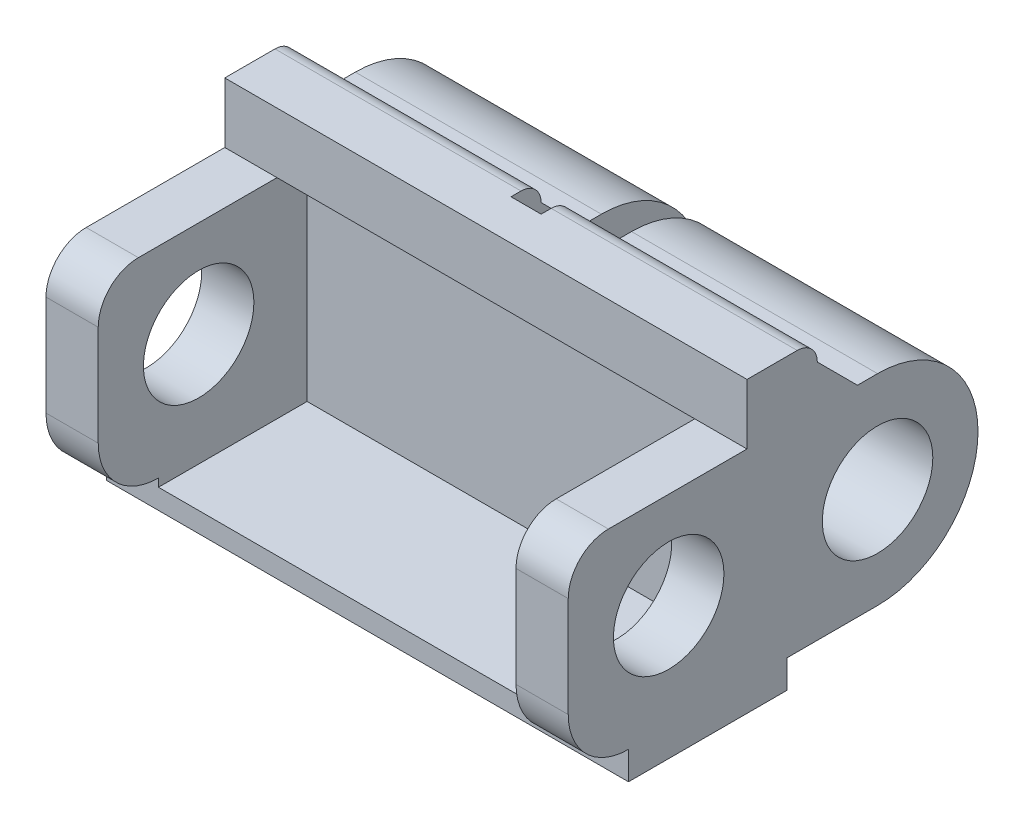
ISO-10303-21;
HEADER;
FILE_DESCRIPTION(('STEP AP214'),'2;1');
FILE_NAME('part.step','',(''),(''),'','','');
FILE_SCHEMA(('AUTOMOTIVE_DESIGN { 1 0 10303 214 1 1 1 1 }'));
ENDSEC;
DATA;
#1=APPLICATION_CONTEXT('core data for automotive mechanical design processes');
#2=APPLICATION_PROTOCOL_DEFINITION('international standard','automotive_design',2000,#1);
#3=PRODUCT_CONTEXT('',#1,'mechanical');
#4=PRODUCT('Part','Part','',(#3));
#5=PRODUCT_RELATED_PRODUCT_CATEGORY('part','',(#4));
#6=PRODUCT_DEFINITION_FORMATION('','',#4);
#7=PRODUCT_DEFINITION_CONTEXT('part definition',#1,'design');
#8=PRODUCT_DEFINITION('design','',#6,#7);
#9=PRODUCT_DEFINITION_SHAPE('','',#8);
#10=(LENGTH_UNIT() NAMED_UNIT(*) SI_UNIT(.MILLI.,.METRE.));
#11=(NAMED_UNIT(*) PLANE_ANGLE_UNIT() SI_UNIT($,.RADIAN.));
#12=(NAMED_UNIT(*) SI_UNIT($,.STERADIAN.) SOLID_ANGLE_UNIT());
#13=UNCERTAINTY_MEASURE_WITH_UNIT(LENGTH_MEASURE(1.E-05),#10,'distance_accuracy_value','');
#14=(GEOMETRIC_REPRESENTATION_CONTEXT(3) GLOBAL_UNCERTAINTY_ASSIGNED_CONTEXT((#13)) GLOBAL_UNIT_ASSIGNED_CONTEXT((#10,
#11,#12)) REPRESENTATION_CONTEXT('',''));
#15=CARTESIAN_POINT('',(0.,0.,0.));
#16=DIRECTION('',(0.,0.,1.));
#17=DIRECTION('',(1.,0.,0.));
#18=AXIS2_PLACEMENT_3D('',#15,#16,#17);
#19=CARTESIAN_POINT('',(0.,44.45,0.));
#20=DIRECTION('',(0.,1.,0.));
#21=DIRECTION('',(0.,0.,1.));
#22=AXIS2_PLACEMENT_3D('',#19,#20,#21);
#23=PLANE('',#22);
#24=DIRECTION('',(0.,0.,1.));
#25=VECTOR('',#24,1.);
#26=CARTESIAN_POINT('',(-13.,44.45,0.));
#27=LINE('',#26,#25);
#28=CARTESIAN_POINT('',(-13.,44.45,35.6));
#29=VERTEX_POINT('',#28);
#30=CARTESIAN_POINT('',(-13.,44.45,38.1));
#31=VERTEX_POINT('',#30);
#32=EDGE_CURVE('E245',#29,#31,#27,.T.);
#33=ORIENTED_EDGE('',*,*,#32,.T.);
#34=DIRECTION('',(-1.,0.,0.));
#35=VECTOR('',#34,1.);
#36=CARTESIAN_POINT('',(13.,44.45,38.1));
#37=LINE('',#36,#35);
#38=CARTESIAN_POINT('',(13.,44.45,38.1));
#39=VERTEX_POINT('',#38);
#40=EDGE_CURVE('E232',#39,#31,#37,.T.);
#41=ORIENTED_EDGE('',*,*,#40,.F.);
#42=DIRECTION('',(0.,0.,-1.));
#43=VECTOR('',#42,1.);
#44=CARTESIAN_POINT('',(13.,44.45,0.));
#45=LINE('',#44,#43);
#46=CARTESIAN_POINT('',(13.,44.45,35.6));
#47=VERTEX_POINT('',#46);
#48=EDGE_CURVE('E242',#39,#47,#45,.T.);
#49=ORIENTED_EDGE('',*,*,#48,.T.);
#50=DIRECTION('',(1.,0.,0.));
#51=VECTOR('',#50,1.);
#52=CARTESIAN_POINT('',(0.,44.45,35.6));
#53=LINE('',#52,#51);
#54=CARTESIAN_POINT('',(0.749999999999987,44.45,35.6));
#55=VERTEX_POINT('',#54);
#56=EDGE_CURVE('E422',#47,#55,#53,.F.);
#57=ORIENTED_EDGE('',*,*,#56,.T.);
#58=DIRECTION('',(0.,0.,1.));
#59=VECTOR('',#58,1.);
#60=CARTESIAN_POINT('',(0.749999999999987,44.45,0.));
#61=LINE('',#60,#59);
#62=CARTESIAN_POINT('',(0.749999999999987,44.45,36.1));
#63=VERTEX_POINT('',#62);
#64=EDGE_CURVE('E253',#55,#63,#61,.T.);
#65=ORIENTED_EDGE('',*,*,#64,.T.);
#66=DIRECTION('',(-1.,0.,0.));
#67=VECTOR('',#66,1.);
#68=CARTESIAN_POINT('',(0.,44.45,36.1));
#69=LINE('',#68,#67);
#70=CARTESIAN_POINT('',(-0.750000000000015,44.45,36.1));
#71=VERTEX_POINT('',#70);
#72=EDGE_CURVE('E255',#63,#71,#69,.T.);
#73=ORIENTED_EDGE('',*,*,#72,.T.);
#74=DIRECTION('',(0.,0.,-1.));
#75=VECTOR('',#74,1.);
#76=CARTESIAN_POINT('',(-0.750000000000015,44.45,0.));
#77=LINE('',#76,#75);
#78=CARTESIAN_POINT('',(-0.750000000000015,44.45,35.6));
#79=VERTEX_POINT('',#78);
#80=EDGE_CURVE('E263',#71,#79,#77,.T.);
#81=ORIENTED_EDGE('',*,*,#80,.T.);
#82=DIRECTION('',(1.,0.,0.));
#83=VECTOR('',#82,1.);
#84=CARTESIAN_POINT('',(0.,44.45,35.6));
#85=LINE('',#84,#83);
#86=EDGE_CURVE('E424',#79,#29,#85,.F.);
#87=ORIENTED_EDGE('',*,*,#86,.T.);
#88=EDGE_LOOP('',(#33,#41,#49,#57,#65,#73,#81,#87));
#89=FACE_BOUND('',#88,.T.);
#90=ADVANCED_FACE('F38',(#89),#23,.T.);
#91=CARTESIAN_POINT('',(-13.,41.45,37.6));
#92=DIRECTION('',(0.,1.,0.));
#93=DIRECTION('',(0.,0.,1.));
#94=AXIS2_PLACEMENT_3D('',#91,#92,#93);
#95=PLANE('',#94);
#96=DIRECTION('',(1.,0.,0.));
#97=VECTOR('',#96,1.);
#98=CARTESIAN_POINT('',(-13.,41.45,38.1));
#99=LINE('',#98,#97);
#100=CARTESIAN_POINT('',(-10.4,41.45,38.1));
#101=VERTEX_POINT('',#100);
#102=CARTESIAN_POINT('',(10.4,41.45,38.1));
#103=VERTEX_POINT('',#102);
#104=EDGE_CURVE('E499',#101,#103,#99,.T.);
#105=ORIENTED_EDGE('',*,*,#104,.F.);
#106=DIRECTION('',(0.,0.,1.));
#107=VECTOR('',#106,1.);
#108=CARTESIAN_POINT('',(-10.4,41.45,36.6));
#109=LINE('',#108,#107);
#110=CARTESIAN_POINT('',(-10.4,41.45,36.6));
#111=VERTEX_POINT('',#110);
#112=EDGE_CURVE('E365',#111,#101,#109,.T.);
#113=ORIENTED_EDGE('',*,*,#112,.F.);
#114=DIRECTION('',(1.,0.,0.));
#115=VECTOR('',#114,1.);
#116=CARTESIAN_POINT('',(-13.,41.45,36.6));
#117=LINE('',#116,#115);
#118=CARTESIAN_POINT('',(10.4,41.45,36.6));
#119=VERTEX_POINT('',#118);
#120=EDGE_CURVE('E482',#111,#119,#117,.T.);
#121=ORIENTED_EDGE('',*,*,#120,.T.);
#122=DIRECTION('',(0.,0.,-1.));
#123=VECTOR('',#122,1.);
#124=CARTESIAN_POINT('',(10.4,41.45,44.));
#125=LINE('',#124,#123);
#126=EDGE_CURVE('E484',#103,#119,#125,.T.);
#127=ORIENTED_EDGE('',*,*,#126,.F.);
#128=EDGE_LOOP('',(#105,#113,#121,#127));
#129=FACE_BOUND('',#128,.T.);
#130=ADVANCED_FACE('F498',(#129),#95,.F.);
#131=CARTESIAN_POINT('',(-27.142135623731,0.,36.6));
#132=DIRECTION('',(0.,0.,-1.));
#133=DIRECTION('',(-1.,0.,0.));
#134=AXIS2_PLACEMENT_3D('',#131,#132,#133);
#135=PLANE('',#134);
#136=ORIENTED_EDGE('',*,*,#120,.F.);
#137=DIRECTION('',(0.,1.,0.));
#138=VECTOR('',#137,1.);
#139=CARTESIAN_POINT('',(-10.4,31.45,36.6));
#140=LINE('',#139,#138);
#141=CARTESIAN_POINT('',(-10.4,31.05,36.6));
#142=VERTEX_POINT('',#141);
#143=EDGE_CURVE('E352',#142,#111,#140,.T.);
#144=ORIENTED_EDGE('',*,*,#143,.F.);
#145=DIRECTION('',(-1.,0.,0.));
#146=VECTOR('',#145,1.);
#147=CARTESIAN_POINT('',(-27.142135623731,31.05,36.6));
#148=LINE('',#147,#146);
#149=CARTESIAN_POINT('',(10.4,31.05,36.6));
#150=VERTEX_POINT('',#149);
#151=EDGE_CURVE('E276',#150,#142,#148,.T.);
#152=ORIENTED_EDGE('',*,*,#151,.F.);
#153=DIRECTION('',(0.,-1.,0.));
#154=VECTOR('',#153,1.);
#155=CARTESIAN_POINT('',(10.4,41.45,36.6));
#156=LINE('',#155,#154);
#157=EDGE_CURVE('E315',#119,#150,#156,.T.);
#158=ORIENTED_EDGE('',*,*,#157,.F.);
#159=EDGE_LOOP('',(#136,#144,#152,#158));
#160=FACE_BOUND('',#159,.T.);
#161=ADVANCED_FACE('F496',(#160),#135,.F.);
#162=CARTESIAN_POINT('',(-13.,41.45,47.));
#163=DIRECTION('',(0.,-1.,0.));
#164=DIRECTION('',(0.,0.,-1.));
#165=AXIS2_PLACEMENT_3D('',#162,#163,#164);
#166=PLANE('',#165);
#167=DIRECTION('',(0.,0.,-1.));
#168=VECTOR('',#167,1.);
#169=CARTESIAN_POINT('',(-13.,41.45,47.));
#170=LINE('',#169,#168);
#171=CARTESIAN_POINT('',(-13.,41.45,32.6));
#172=VERTEX_POINT('',#171);
#173=CARTESIAN_POINT('',(-13.,41.45,31.6));
#174=VERTEX_POINT('',#173);
#175=EDGE_CURVE('E386',#172,#174,#170,.T.);
#176=ORIENTED_EDGE('',*,*,#175,.F.);
#177=DIRECTION('',(1.,0.,0.));
#178=VECTOR('',#177,1.);
#179=CARTESIAN_POINT('',(-13.,41.45,32.6));
#180=LINE('',#179,#178);
#181=CARTESIAN_POINT('',(-0.750000000000015,41.45,32.6));
#182=VERTEX_POINT('',#181);
#183=EDGE_CURVE('E395',#172,#182,#180,.T.);
#184=ORIENTED_EDGE('',*,*,#183,.T.);
#185=DIRECTION('',(0.,0.,1.));
#186=VECTOR('',#185,1.);
#187=CARTESIAN_POINT('',(-0.750000000000015,41.45,47.));
#188=LINE('',#187,#186);
#189=CARTESIAN_POINT('',(-0.750000000000015,41.45,31.6));
#190=VERTEX_POINT('',#189);
#191=EDGE_CURVE('E309',#190,#182,#188,.T.);
#192=ORIENTED_EDGE('',*,*,#191,.F.);
#193=DIRECTION('',(1.,0.,0.));
#194=VECTOR('',#193,1.);
#195=CARTESIAN_POINT('',(-27.142135623731,41.45,31.6));
#196=LINE('',#195,#194);
#197=EDGE_CURVE('E359',#174,#190,#196,.T.);
#198=ORIENTED_EDGE('',*,*,#197,.F.);
#199=EDGE_LOOP('',(#176,#184,#192,#198));
#200=FACE_BOUND('',#199,.T.);
#201=ADVANCED_FACE('F579',(#200),#166,.F.);
#202=DIRECTION('',(0.,0.,-1.));
#203=VECTOR('',#202,1.);
#204=CARTESIAN_POINT('',(13.,41.45,0.));
#205=LINE('',#204,#203);
#206=CARTESIAN_POINT('',(13.,41.45,45.));
#207=VERTEX_POINT('',#206);
#208=CARTESIAN_POINT('',(13.,41.45,38.1));
#209=VERTEX_POINT('',#208);
#210=EDGE_CURVE('E341',#207,#209,#205,.T.);
#211=ORIENTED_EDGE('',*,*,#210,.T.);
#212=EDGE_CURVE('E235',#103,#209,#99,.T.);
#213=ORIENTED_EDGE('',*,*,#212,.F.);
#214=CARTESIAN_POINT('',(10.4,41.45,45.));
#215=VERTEX_POINT('',#214);
#216=EDGE_CURVE('E257',#215,#103,#125,.T.);
#217=ORIENTED_EDGE('',*,*,#216,.F.);
#218=DIRECTION('',(-1.,0.,0.));
#219=VECTOR('',#218,1.);
#220=CARTESIAN_POINT('',(-13.,41.45,45.));
#221=LINE('',#220,#219);
#222=EDGE_CURVE('E437',#215,#207,#221,.F.);
#223=ORIENTED_EDGE('',*,*,#222,.T.);
#224=EDGE_LOOP('',(#211,#213,#217,#223));
#225=FACE_BOUND('',#224,.T.);
#226=ADVANCED_FACE('F521',(#225),#166,.F.);
#227=CARTESIAN_POINT('',(-10.4,41.45,45.));
#228=VERTEX_POINT('',#227);
#229=EDGE_CURVE('E364',#101,#228,#109,.T.);
#230=ORIENTED_EDGE('',*,*,#229,.F.);
#231=CARTESIAN_POINT('',(-13.,41.45,38.1));
#232=VERTEX_POINT('',#231);
#233=EDGE_CURVE('E506',#232,#101,#99,.T.);
#234=ORIENTED_EDGE('',*,*,#233,.F.);
#235=CARTESIAN_POINT('',(-13.,41.45,45.));
#236=VERTEX_POINT('',#235);
#237=EDGE_CURVE('E387',#236,#232,#170,.T.);
#238=ORIENTED_EDGE('',*,*,#237,.F.);
#239=DIRECTION('',(1.,0.,0.));
#240=VECTOR('',#239,1.);
#241=CARTESIAN_POINT('',(-13.,41.45,45.));
#242=LINE('',#241,#240);
#243=EDGE_CURVE('E441',#236,#228,#242,.T.);
#244=ORIENTED_EDGE('',*,*,#243,.T.);
#245=EDGE_LOOP('',(#230,#234,#238,#244));
#246=FACE_BOUND('',#245,.T.);
#247=ADVANCED_FACE('F447',(#246),#166,.F.);
#248=CARTESIAN_POINT('',(-10.4,34.45,44.));
#249=DIRECTION('',(1.,0.,0.));
#250=DIRECTION('',(0.,0.,-1.));
#251=AXIS2_PLACEMENT_3D('',#248,#249,#250);
#252=PLANE('',#251);
#253=CARTESIAN_POINT('',(-10.4,36.65,42.));
#254=DIRECTION('',(1.,0.,0.));
#255=DIRECTION('',(0.,0.,-1.));
#256=AXIS2_PLACEMENT_3D('',#253,#254,#255);
#257=CIRCLE('',#256,2.75);
#258=CARTESIAN_POINT('',(-10.4,36.65,39.25));
#259=VERTEX_POINT('',#258);
#260=EDGE_CURVE('E373',#259,#259,#257,.T.);
#261=ORIENTED_EDGE('',*,*,#260,.F.);
#262=EDGE_LOOP('',(#261));
#263=FACE_BOUND('',#262,.T.);
#264=ORIENTED_EDGE('',*,*,#112,.T.);
#265=ORIENTED_EDGE('',*,*,#229,.T.);
#266=CARTESIAN_POINT('',(-10.4,39.45,45.));
#267=DIRECTION('',(1.,0.,0.));
#268=DIRECTION('',(0.,0.,-1.));
#269=AXIS2_PLACEMENT_3D('',#266,#267,#268);
#270=CIRCLE('',#269,2.);
#271=CARTESIAN_POINT('',(-10.4,39.45,47.));
#272=VERTEX_POINT('',#271);
#273=EDGE_CURVE('E60',#228,#272,#270,.T.);
#274=ORIENTED_EDGE('',*,*,#273,.T.);
#275=DIRECTION('',(0.,-1.,0.));
#276=VECTOR('',#275,1.);
#277=CARTESIAN_POINT('',(-10.4,41.45,47.));
#278=LINE('',#277,#276);
#279=CARTESIAN_POINT('',(-10.4,34.45,47.));
#280=VERTEX_POINT('',#279);
#281=EDGE_CURVE('E368',#272,#280,#278,.T.);
#282=ORIENTED_EDGE('',*,*,#281,.T.);
#283=CARTESIAN_POINT('',(-10.4,34.45,44.));
#284=DIRECTION('',(1.,0.,0.));
#285=DIRECTION('',(0.,0.,-1.));
#286=AXIS2_PLACEMENT_3D('',#283,#284,#285);
#287=CIRCLE('',#286,3.);
#288=CARTESIAN_POINT('',(-10.4,31.45,44.));
#289=VERTEX_POINT('',#288);
#290=EDGE_CURVE('E370',#280,#289,#287,.T.);
#291=ORIENTED_EDGE('',*,*,#290,.T.);
#292=DIRECTION('',(0.,1.,0.));
#293=VECTOR('',#292,1.);
#294=CARTESIAN_POINT('',(-10.4,31.05,44.));
#295=LINE('',#294,#293);
#296=CARTESIAN_POINT('',(-10.4,31.05,44.));
#297=VERTEX_POINT('',#296);
#298=EDGE_CURVE('E464',#297,#289,#295,.T.);
#299=ORIENTED_EDGE('',*,*,#298,.F.);
#300=DIRECTION('',(0.,0.,-1.));
#301=VECTOR('',#300,1.);
#302=CARTESIAN_POINT('',(-10.4,31.05,44.));
#303=LINE('',#302,#301);
#304=EDGE_CURVE('E279',#297,#142,#303,.T.);
#305=ORIENTED_EDGE('',*,*,#304,.T.);
#306=ORIENTED_EDGE('',*,*,#143,.T.);
#307=EDGE_LOOP('',(#264,#265,#274,#282,#291,#299,#305,#306));
#308=FACE_BOUND('',#307,.T.);
#309=ADVANCED_FACE('F463',(#263,#308),#252,.T.);
#310=CARTESIAN_POINT('',(10.4,34.45,44.));
#311=DIRECTION('',(-1.,0.,0.));
#312=DIRECTION('',(0.,0.,1.));
#313=AXIS2_PLACEMENT_3D('',#310,#311,#312);
#314=PLANE('',#313);
#315=DIRECTION('',(0.,-1.,0.));
#316=VECTOR('',#315,1.);
#317=CARTESIAN_POINT('',(10.4,31.45,44.));
#318=LINE('',#317,#316);
#319=CARTESIAN_POINT('',(10.4,31.45,44.));
#320=VERTEX_POINT('',#319);
#321=CARTESIAN_POINT('',(10.4,31.05,44.));
#322=VERTEX_POINT('',#321);
#323=EDGE_CURVE('E474',#320,#322,#318,.T.);
#324=ORIENTED_EDGE('',*,*,#323,.F.);
#325=CARTESIAN_POINT('',(10.4,34.45,44.));
#326=DIRECTION('',(-1.,0.,0.));
#327=DIRECTION('',(0.,0.,1.));
#328=AXIS2_PLACEMENT_3D('',#325,#326,#327);
#329=CIRCLE('',#328,3.);
#330=CARTESIAN_POINT('',(10.4,34.45,47.));
#331=VERTEX_POINT('',#330);
#332=EDGE_CURVE('E318',#320,#331,#329,.T.);
#333=ORIENTED_EDGE('',*,*,#332,.T.);
#334=DIRECTION('',(0.,1.,0.));
#335=VECTOR('',#334,1.);
#336=CARTESIAN_POINT('',(10.4,34.45,47.));
#337=LINE('',#336,#335);
#338=CARTESIAN_POINT('',(10.4,39.45,47.));
#339=VERTEX_POINT('',#338);
#340=EDGE_CURVE('E312',#331,#339,#337,.T.);
#341=ORIENTED_EDGE('',*,*,#340,.T.);
#342=CARTESIAN_POINT('',(10.4,39.45,45.));
#343=DIRECTION('',(-1.,0.,0.));
#344=DIRECTION('',(0.,0.,1.));
#345=AXIS2_PLACEMENT_3D('',#342,#343,#344);
#346=CIRCLE('',#345,2.);
#347=EDGE_CURVE('E434',#339,#215,#346,.T.);
#348=ORIENTED_EDGE('',*,*,#347,.T.);
#349=ORIENTED_EDGE('',*,*,#216,.T.);
#350=ORIENTED_EDGE('',*,*,#126,.T.);
#351=ORIENTED_EDGE('',*,*,#157,.T.);
#352=DIRECTION('',(0.,0.,1.));
#353=VECTOR('',#352,1.);
#354=CARTESIAN_POINT('',(10.4,31.05,44.));
#355=LINE('',#354,#353);
#356=EDGE_CURVE('E274',#150,#322,#355,.T.);
#357=ORIENTED_EDGE('',*,*,#356,.T.);
#358=EDGE_LOOP('',(#324,#333,#341,#348,#349,#350,#351,#357));
#359=FACE_BOUND('',#358,.T.);
#360=CARTESIAN_POINT('',(10.4,36.65,42.));
#361=DIRECTION('',(-1.,0.,0.));
#362=DIRECTION('',(0.,0.,1.));
#363=AXIS2_PLACEMENT_3D('',#360,#361,#362);
#364=CIRCLE('',#363,2.75);
#365=CARTESIAN_POINT('',(10.4,36.65,44.75));
#366=VERTEX_POINT('',#365);
#367=EDGE_CURVE('E320',#366,#366,#364,.F.);
#368=ORIENTED_EDGE('',*,*,#367,.T.);
#369=EDGE_LOOP('',(#368));
#370=FACE_BOUND('',#369,.T.);
#371=ADVANCED_FACE('F490',(#359,#370),#314,.T.);
#372=CARTESIAN_POINT('',(-13.,31.45,40.));
#373=DIRECTION('',(0.,1.,0.));
#374=DIRECTION('',(0.,0.,1.));
#375=AXIS2_PLACEMENT_3D('',#372,#373,#374);
#376=PLANE('',#375);
#377=DIRECTION('',(1.,0.,0.));
#378=VECTOR('',#377,1.);
#379=CARTESIAN_POINT('',(13.,31.45,36.1));
#380=LINE('',#379,#378);
#381=CARTESIAN_POINT('',(-13.,31.45,36.1));
#382=VERTEX_POINT('',#381);
#383=CARTESIAN_POINT('',(-0.750000000000015,31.45,36.1));
#384=VERTEX_POINT('',#383);
#385=EDGE_CURVE('E282',#382,#384,#380,.T.);
#386=ORIENTED_EDGE('',*,*,#385,.F.);
#387=DIRECTION('',(0.,0.,1.));
#388=VECTOR('',#387,1.);
#389=CARTESIAN_POINT('',(-13.,31.45,40.));
#390=LINE('',#389,#388);
#391=CARTESIAN_POINT('',(-13.,31.45,31.6));
#392=VERTEX_POINT('',#391);
#393=EDGE_CURVE('E379',#392,#382,#390,.T.);
#394=ORIENTED_EDGE('',*,*,#393,.F.);
#395=DIRECTION('',(1.,0.,0.));
#396=VECTOR('',#395,1.);
#397=CARTESIAN_POINT('',(-27.142135623731,31.45,31.6));
#398=LINE('',#397,#396);
#399=CARTESIAN_POINT('',(-0.750000000000015,31.45,31.6));
#400=VERTEX_POINT('',#399);
#401=EDGE_CURVE('E349',#392,#400,#398,.T.);
#402=ORIENTED_EDGE('',*,*,#401,.T.);
#403=DIRECTION('',(0.,0.,-1.));
#404=VECTOR('',#403,1.);
#405=CARTESIAN_POINT('',(-0.750000000000015,31.45,36.1));
#406=LINE('',#405,#404);
#407=EDGE_CURVE('E297',#384,#400,#406,.T.);
#408=ORIENTED_EDGE('',*,*,#407,.F.);
#409=EDGE_LOOP('',(#386,#394,#402,#408));
#410=FACE_BOUND('',#409,.T.);
#411=ADVANCED_FACE('F586',(#410),#376,.F.);
#412=CARTESIAN_POINT('',(0.749999999999987,31.45,36.1));
#413=VERTEX_POINT('',#412);
#414=CARTESIAN_POINT('',(13.,31.45,36.1));
#415=VERTEX_POINT('',#414);
#416=EDGE_CURVE('E281',#413,#415,#380,.T.);
#417=ORIENTED_EDGE('',*,*,#416,.F.);
#418=DIRECTION('',(0.,0.,-1.));
#419=VECTOR('',#418,1.);
#420=CARTESIAN_POINT('',(0.749999999999987,31.45,36.1));
#421=LINE('',#420,#419);
#422=CARTESIAN_POINT('',(0.749999999999987,31.45,31.6));
#423=VERTEX_POINT('',#422);
#424=EDGE_CURVE('E294',#413,#423,#421,.T.);
#425=ORIENTED_EDGE('',*,*,#424,.T.);
#426=CARTESIAN_POINT('',(13.,31.45,31.6));
#427=VERTEX_POINT('',#426);
#428=EDGE_CURVE('E358',#423,#427,#398,.T.);
#429=ORIENTED_EDGE('',*,*,#428,.T.);
#430=DIRECTION('',(0.,0.,-1.));
#431=VECTOR('',#430,1.);
#432=CARTESIAN_POINT('',(13.,31.45,0.));
#433=LINE('',#432,#431);
#434=EDGE_CURVE('E337',#415,#427,#433,.T.);
#435=ORIENTED_EDGE('',*,*,#434,.F.);
#436=EDGE_LOOP('',(#417,#425,#429,#435));
#437=FACE_BOUND('',#436,.T.);
#438=ADVANCED_FACE('F537',(#437),#376,.F.);
#439=DIRECTION('',(0.,0.,-1.));
#440=VECTOR('',#439,1.);
#441=CARTESIAN_POINT('',(0.749999999999987,41.45,47.));
#442=LINE('',#441,#440);
#443=CARTESIAN_POINT('',(0.749999999999987,41.45,32.6));
#444=VERTEX_POINT('',#443);
#445=CARTESIAN_POINT('',(0.749999999999987,41.45,31.6));
#446=VERTEX_POINT('',#445);
#447=EDGE_CURVE('E303',#444,#446,#442,.T.);
#448=ORIENTED_EDGE('',*,*,#447,.F.);
#449=DIRECTION('',(1.,0.,0.));
#450=VECTOR('',#449,1.);
#451=CARTESIAN_POINT('',(-13.,41.45,32.6));
#452=LINE('',#451,#450);
#453=CARTESIAN_POINT('',(13.,41.45,32.6));
#454=VERTEX_POINT('',#453);
#455=EDGE_CURVE('E405',#444,#454,#452,.T.);
#456=ORIENTED_EDGE('',*,*,#455,.T.);
#457=CARTESIAN_POINT('',(13.,41.45,31.6));
#458=VERTEX_POINT('',#457);
#459=EDGE_CURVE('E343',#454,#458,#205,.T.);
#460=ORIENTED_EDGE('',*,*,#459,.T.);
#461=EDGE_CURVE('E355',#446,#458,#196,.T.);
#462=ORIENTED_EDGE('',*,*,#461,.F.);
#463=EDGE_LOOP('',(#448,#456,#460,#462));
#464=FACE_BOUND('',#463,.T.);
#465=ADVANCED_FACE('F549',(#464),#166,.F.);
#466=CARTESIAN_POINT('',(-27.142135623731,36.45,31.6));
#467=DIRECTION('',(1.,0.,0.));
#468=DIRECTION('',(0.,0.,-1.));
#469=AXIS2_PLACEMENT_3D('',#466,#467,#468);
#470=CYLINDRICAL_SURFACE('',#469,5.);
#471=ORIENTED_EDGE('',*,*,#197,.T.);
#472=CARTESIAN_POINT('',(-0.750000000000015,36.45,31.6));
#473=DIRECTION('',(1.,0.,0.));
#474=DIRECTION('',(0.,0.,-1.));
#475=AXIS2_PLACEMENT_3D('',#472,#473,#474);
#476=CIRCLE('',#475,5.);
#477=EDGE_CURVE('E306',#190,#400,#476,.F.);
#478=ORIENTED_EDGE('',*,*,#477,.T.);
#479=ORIENTED_EDGE('',*,*,#401,.F.);
#480=CARTESIAN_POINT('',(-13.,36.45,31.6));
#481=DIRECTION('',(-1.,0.,0.));
#482=DIRECTION('',(0.,0.,1.));
#483=AXIS2_PLACEMENT_3D('',#480,#481,#482);
#484=CIRCLE('',#483,5.);
#485=EDGE_CURVE('E336',#392,#174,#484,.F.);
#486=ORIENTED_EDGE('',*,*,#485,.T.);
#487=EDGE_LOOP('',(#471,#478,#479,#486));
#488=FACE_BOUND('',#487,.T.);
#489=ADVANCED_FACE('F583',(#488),#470,.T.);
#490=ORIENTED_EDGE('',*,*,#428,.F.);
#491=CARTESIAN_POINT('',(0.749999999999987,36.45,31.6));
#492=DIRECTION('',(-1.,0.,0.));
#493=DIRECTION('',(0.,0.,1.));
#494=AXIS2_PLACEMENT_3D('',#491,#492,#493);
#495=CIRCLE('',#494,5.);
#496=EDGE_CURVE('E300',#423,#446,#495,.F.);
#497=ORIENTED_EDGE('',*,*,#496,.T.);
#498=ORIENTED_EDGE('',*,*,#461,.T.);
#499=CARTESIAN_POINT('',(13.,36.45,31.6));
#500=DIRECTION('',(1.,0.,0.));
#501=DIRECTION('',(0.,0.,-1.));
#502=AXIS2_PLACEMENT_3D('',#499,#500,#501);
#503=CIRCLE('',#502,5.);
#504=EDGE_CURVE('E340',#427,#458,#503,.T.);
#505=ORIENTED_EDGE('',*,*,#504,.F.);
#506=EDGE_LOOP('',(#490,#497,#498,#505));
#507=FACE_BOUND('',#506,.T.);
#508=ADVANCED_FACE('F543',(#507),#470,.T.);
#509=CARTESIAN_POINT('',(-27.142135623731,36.45,31.6));
#510=DIRECTION('',(1.,0.,0.));
#511=DIRECTION('',(0.,0.,-1.));
#512=AXIS2_PLACEMENT_3D('',#509,#510,#511);
#513=CYLINDRICAL_SURFACE('',#512,2.75);
#514=CARTESIAN_POINT('',(-13.,36.45,31.6));
#515=DIRECTION('',(-1.,0.,0.));
#516=DIRECTION('',(0.,0.,1.));
#517=AXIS2_PLACEMENT_3D('',#514,#515,#516);
#518=CIRCLE('',#517,2.75);
#519=CARTESIAN_POINT('',(-13.,36.45,34.35));
#520=VERTEX_POINT('',#519);
#521=EDGE_CURVE('E339',#520,#520,#518,.F.);
#522=ORIENTED_EDGE('',*,*,#521,.F.);
#523=EDGE_LOOP('',(#522));
#524=FACE_BOUND('',#523,.T.);
#525=CARTESIAN_POINT('',(-0.750000000000015,36.45,31.6));
#526=DIRECTION('',(1.,0.,0.));
#527=DIRECTION('',(0.,0.,-1.));
#528=AXIS2_PLACEMENT_3D('',#525,#526,#527);
#529=CIRCLE('',#528,2.75);
#530=CARTESIAN_POINT('',(-0.750000000000015,36.45,28.85));
#531=VERTEX_POINT('',#530);
#532=EDGE_CURVE('E305',#531,#531,#529,.F.);
#533=ORIENTED_EDGE('',*,*,#532,.F.);
#534=EDGE_LOOP('',(#533));
#535=FACE_BOUND('',#534,.T.);
#536=ADVANCED_FACE('F626',(#524,#535),#513,.F.);
#537=CARTESIAN_POINT('',(13.,36.45,31.6));
#538=DIRECTION('',(1.,0.,0.));
#539=DIRECTION('',(0.,0.,-1.));
#540=AXIS2_PLACEMENT_3D('',#537,#538,#539);
#541=CIRCLE('',#540,2.75);
#542=CARTESIAN_POINT('',(13.,36.45,28.85));
#543=VERTEX_POINT('',#542);
#544=EDGE_CURVE('E346',#543,#543,#541,.T.);
#545=ORIENTED_EDGE('',*,*,#544,.T.);
#546=EDGE_LOOP('',(#545));
#547=FACE_BOUND('',#546,.T.);
#548=CARTESIAN_POINT('',(0.749999999999987,36.45,31.6));
#549=DIRECTION('',(-1.,0.,0.));
#550=DIRECTION('',(0.,0.,1.));
#551=AXIS2_PLACEMENT_3D('',#548,#549,#550);
#552=CIRCLE('',#551,2.75);
#553=CARTESIAN_POINT('',(0.749999999999987,36.45,34.35));
#554=VERTEX_POINT('',#553);
#555=EDGE_CURVE('E299',#554,#554,#552,.F.);
#556=ORIENTED_EDGE('',*,*,#555,.F.);
#557=EDGE_LOOP('',(#556));
#558=FACE_BOUND('',#557,.T.);
#559=ADVANCED_FACE('F629',(#547,#558),#513,.F.);
#560=CARTESIAN_POINT('',(-13.,34.45,44.));
#561=DIRECTION('',(1.,0.,0.));
#562=DIRECTION('',(0.,0.,-1.));
#563=AXIS2_PLACEMENT_3D('',#560,#561,#562);
#564=CYLINDRICAL_SURFACE('',#563,3.);
#565=ORIENTED_EDGE('',*,*,#290,.F.);
#566=DIRECTION('',(1.,0.,0.));
#567=VECTOR('',#566,1.);
#568=CARTESIAN_POINT('',(-13.,34.45,47.));
#569=LINE('',#568,#567);
#570=CARTESIAN_POINT('',(-13.,34.45,47.));
#571=VERTEX_POINT('',#570);
#572=EDGE_CURVE('E389',#571,#280,#569,.T.);
#573=ORIENTED_EDGE('',*,*,#572,.F.);
#574=CARTESIAN_POINT('',(-13.,34.45,44.));
#575=DIRECTION('',(-1.,0.,0.));
#576=DIRECTION('',(0.,0.,1.));
#577=AXIS2_PLACEMENT_3D('',#574,#575,#576);
#578=CIRCLE('',#577,3.);
#579=CARTESIAN_POINT('',(-13.,31.45,44.));
#580=VERTEX_POINT('',#579);
#581=EDGE_CURVE('E382',#580,#571,#578,.T.);
#582=ORIENTED_EDGE('',*,*,#581,.F.);
#583=DIRECTION('',(1.,0.,0.));
#584=VECTOR('',#583,1.);
#585=CARTESIAN_POINT('',(-13.,31.45,44.));
#586=LINE('',#585,#584);
#587=EDGE_CURVE('E392',#580,#289,#586,.T.);
#588=ORIENTED_EDGE('',*,*,#587,.T.);
#589=EDGE_LOOP('',(#565,#573,#582,#588));
#590=FACE_BOUND('',#589,.T.);
#591=ADVANCED_FACE('F461',(#590),#564,.T.);
#592=CARTESIAN_POINT('',(-13.,34.45,47.));
#593=DIRECTION('',(0.,0.,-1.));
#594=DIRECTION('',(-1.,0.,0.));
#595=AXIS2_PLACEMENT_3D('',#592,#593,#594);
#596=PLANE('',#595);
#597=ORIENTED_EDGE('',*,*,#281,.F.);
#598=DIRECTION('',(1.,0.,0.));
#599=VECTOR('',#598,1.);
#600=CARTESIAN_POINT('',(-13.,39.45,47.));
#601=LINE('',#600,#599);
#602=CARTESIAN_POINT('',(-13.,39.45,47.));
#603=VERTEX_POINT('',#602);
#604=EDGE_CURVE('E46',#272,#603,#601,.F.);
#605=ORIENTED_EDGE('',*,*,#604,.T.);
#606=DIRECTION('',(0.,1.,0.));
#607=VECTOR('',#606,1.);
#608=CARTESIAN_POINT('',(-13.,34.45,47.));
#609=LINE('',#608,#607);
#610=EDGE_CURVE('E384',#571,#603,#609,.T.);
#611=ORIENTED_EDGE('',*,*,#610,.F.);
#612=ORIENTED_EDGE('',*,*,#572,.T.);
#613=EDGE_LOOP('',(#597,#605,#611,#612));
#614=FACE_BOUND('',#613,.T.);
#615=ADVANCED_FACE('F458',(#614),#596,.F.);
#616=CARTESIAN_POINT('',(-13.,36.65,42.));
#617=DIRECTION('',(1.,0.,0.));
#618=DIRECTION('',(0.,0.,-1.));
#619=AXIS2_PLACEMENT_3D('',#616,#617,#618);
#620=CYLINDRICAL_SURFACE('',#619,2.75);
#621=CARTESIAN_POINT('',(-13.,36.65,42.));
#622=DIRECTION('',(-1.,0.,0.));
#623=DIRECTION('',(0.,0.,1.));
#624=AXIS2_PLACEMENT_3D('',#621,#622,#623);
#625=CIRCLE('',#624,2.75);
#626=CARTESIAN_POINT('',(-13.,36.65,44.75));
#627=VERTEX_POINT('',#626);
#628=EDGE_CURVE('E376',#627,#627,#625,.T.);
#629=ORIENTED_EDGE('',*,*,#628,.T.);
#630=EDGE_LOOP('',(#629));
#631=FACE_BOUND('',#630,.T.);
#632=ORIENTED_EDGE('',*,*,#260,.T.);
#633=EDGE_LOOP('',(#632));
#634=FACE_BOUND('',#633,.T.);
#635=ADVANCED_FACE('F638',(#631,#634),#620,.F.);
#636=CARTESIAN_POINT('',(-13.,34.45,40.));
#637=DIRECTION('',(-1.,0.,0.));
#638=DIRECTION('',(0.,0.,1.));
#639=AXIS2_PLACEMENT_3D('',#636,#637,#638);
#640=PLANE('',#639);
#641=ORIENTED_EDGE('',*,*,#237,.T.);
#642=DIRECTION('',(0.,-1.,0.));
#643=VECTOR('',#642,1.);
#644=CARTESIAN_POINT('',(-13.,44.45,38.1));
#645=LINE('',#644,#643);
#646=EDGE_CURVE('E246',#31,#232,#645,.T.);
#647=ORIENTED_EDGE('',*,*,#646,.F.);
#648=ORIENTED_EDGE('',*,*,#32,.F.);
#649=CARTESIAN_POINT('',(-13.,43.45,35.6));
#650=DIRECTION('',(-1.,0.,0.));
#651=DIRECTION('',(0.,0.,1.));
#652=AXIS2_PLACEMENT_3D('',#649,#650,#651);
#653=CIRCLE('',#652,1.);
#654=CARTESIAN_POINT('',(-13.,43.45,34.6));
#655=VERTEX_POINT('',#654);
#656=EDGE_CURVE('E426',#29,#655,#653,.T.);
#657=ORIENTED_EDGE('',*,*,#656,.T.);
#658=DIRECTION('',(0.,-0.707106781186544,-0.707106781186551));
#659=VECTOR('',#658,1.);
#660=CARTESIAN_POINT('',(-13.,41.45,32.6));
#661=LINE('',#660,#659);
#662=EDGE_CURVE('E414',#655,#172,#661,.T.);
#663=ORIENTED_EDGE('',*,*,#662,.T.);
#664=ORIENTED_EDGE('',*,*,#175,.T.);
#665=ORIENTED_EDGE('',*,*,#485,.F.);
#666=ORIENTED_EDGE('',*,*,#393,.T.);
#667=DIRECTION('',(0.,1.,0.));
#668=VECTOR('',#667,1.);
#669=CARTESIAN_POINT('',(-13.,30.45,36.1));
#670=LINE('',#669,#668);
#671=CARTESIAN_POINT('',(-13.,30.05,36.1));
#672=VERTEX_POINT('',#671);
#673=EDGE_CURVE('E287',#672,#382,#670,.T.);
#674=ORIENTED_EDGE('',*,*,#673,.F.);
#675=DIRECTION('',(0.,0.,1.));
#676=VECTOR('',#675,1.);
#677=CARTESIAN_POINT('',(-13.,30.05,0.));
#678=LINE('',#677,#676);
#679=CARTESIAN_POINT('',(-13.,30.05,44.));
#680=VERTEX_POINT('',#679);
#681=EDGE_CURVE('E269',#672,#680,#678,.T.);
#682=ORIENTED_EDGE('',*,*,#681,.T.);
#683=DIRECTION('',(0.,-1.,0.));
#684=VECTOR('',#683,1.);
#685=CARTESIAN_POINT('',(-13.,31.45,44.));
#686=LINE('',#685,#684);
#687=EDGE_CURVE('E468',#580,#680,#686,.T.);
#688=ORIENTED_EDGE('',*,*,#687,.F.);
#689=ORIENTED_EDGE('',*,*,#581,.T.);
#690=ORIENTED_EDGE('',*,*,#610,.T.);
#691=CARTESIAN_POINT('',(-13.,39.45,45.));
#692=DIRECTION('',(-1.,0.,0.));
#693=DIRECTION('',(0.,0.,1.));
#694=AXIS2_PLACEMENT_3D('',#691,#692,#693);
#695=CIRCLE('',#694,2.);
#696=EDGE_CURVE('E11',#603,#236,#695,.T.);
#697=ORIENTED_EDGE('',*,*,#696,.T.);
#698=EDGE_LOOP('',(#641,#647,#648,#657,#663,#664,#665,#666,#674,#682,#688,#689,#690,#697));
#699=FACE_BOUND('',#698,.T.);
#700=ORIENTED_EDGE('',*,*,#628,.F.);
#701=EDGE_LOOP('',(#700));
#702=FACE_BOUND('',#701,.T.);
#703=ORIENTED_EDGE('',*,*,#521,.T.);
#704=EDGE_LOOP('',(#703));
#705=FACE_BOUND('',#704,.T.);
#706=ADVANCED_FACE('F453',(#699,#702,#705),#640,.T.);
#707=CARTESIAN_POINT('',(13.,0.,0.));
#708=DIRECTION('',(1.,0.,0.));
#709=DIRECTION('',(0.,0.,-1.));
#710=AXIS2_PLACEMENT_3D('',#707,#708,#709);
#711=PLANE('',#710);
#712=DIRECTION('',(0.,1.,0.));
#713=VECTOR('',#712,1.);
#714=CARTESIAN_POINT('',(13.,41.45,38.1));
#715=LINE('',#714,#713);
#716=EDGE_CURVE('E228',#209,#39,#715,.T.);
#717=ORIENTED_EDGE('',*,*,#716,.F.);
#718=ORIENTED_EDGE('',*,*,#210,.F.);
#719=CARTESIAN_POINT('',(13.,39.45,45.));
#720=DIRECTION('',(1.,0.,0.));
#721=DIRECTION('',(0.,0.,-1.));
#722=AXIS2_PLACEMENT_3D('',#719,#720,#721);
#723=CIRCLE('',#722,2.);
#724=CARTESIAN_POINT('',(13.,39.45,47.));
#725=VERTEX_POINT('',#724);
#726=EDGE_CURVE('E439',#207,#725,#723,.T.);
#727=ORIENTED_EDGE('',*,*,#726,.T.);
#728=DIRECTION('',(0.,-1.,0.));
#729=VECTOR('',#728,1.);
#730=CARTESIAN_POINT('',(13.,0.,47.));
#731=LINE('',#730,#729);
#732=CARTESIAN_POINT('',(13.,34.45,47.));
#733=VERTEX_POINT('',#732);
#734=EDGE_CURVE('E323',#725,#733,#731,.T.);
#735=ORIENTED_EDGE('',*,*,#734,.T.);
#736=CARTESIAN_POINT('',(13.,34.45,44.));
#737=DIRECTION('',(1.,0.,0.));
#738=DIRECTION('',(0.,0.,-1.));
#739=AXIS2_PLACEMENT_3D('',#736,#737,#738);
#740=CIRCLE('',#739,3.);
#741=CARTESIAN_POINT('',(13.,31.45,44.));
#742=VERTEX_POINT('',#741);
#743=EDGE_CURVE('E325',#733,#742,#740,.T.);
#744=ORIENTED_EDGE('',*,*,#743,.T.);
#745=DIRECTION('',(0.,1.,0.));
#746=VECTOR('',#745,1.);
#747=CARTESIAN_POINT('',(13.,30.05,44.));
#748=LINE('',#747,#746);
#749=CARTESIAN_POINT('',(13.,30.05,44.));
#750=VERTEX_POINT('',#749);
#751=EDGE_CURVE('E480',#750,#742,#748,.T.);
#752=ORIENTED_EDGE('',*,*,#751,.F.);
#753=DIRECTION('',(0.,0.,-1.));
#754=VECTOR('',#753,1.);
#755=CARTESIAN_POINT('',(13.,30.05,0.));
#756=LINE('',#755,#754);
#757=CARTESIAN_POINT('',(13.,30.05,36.1));
#758=VERTEX_POINT('',#757);
#759=EDGE_CURVE('E266',#750,#758,#756,.T.);
#760=ORIENTED_EDGE('',*,*,#759,.T.);
#761=DIRECTION('',(0.,1.,0.));
#762=VECTOR('',#761,1.);
#763=CARTESIAN_POINT('',(13.,30.45,36.1));
#764=LINE('',#763,#762);
#765=EDGE_CURVE('E285',#758,#415,#764,.T.);
#766=ORIENTED_EDGE('',*,*,#765,.T.);
#767=ORIENTED_EDGE('',*,*,#434,.T.);
#768=ORIENTED_EDGE('',*,*,#504,.T.);
#769=ORIENTED_EDGE('',*,*,#459,.F.);
#770=DIRECTION('',(0.,0.707106781186544,0.707106781186551));
#771=VECTOR('',#770,1.);
#772=CARTESIAN_POINT('',(13.,41.45,32.6));
#773=LINE('',#772,#771);
#774=CARTESIAN_POINT('',(13.,43.45,34.6));
#775=VERTEX_POINT('',#774);
#776=EDGE_CURVE('E416',#454,#775,#773,.T.);
#777=ORIENTED_EDGE('',*,*,#776,.T.);
#778=CARTESIAN_POINT('',(13.,43.45,35.6));
#779=DIRECTION('',(1.,0.,0.));
#780=DIRECTION('',(0.,0.,-1.));
#781=AXIS2_PLACEMENT_3D('',#778,#779,#780);
#782=CIRCLE('',#781,1.);
#783=EDGE_CURVE('E251',#775,#47,#782,.T.);
#784=ORIENTED_EDGE('',*,*,#783,.T.);
#785=ORIENTED_EDGE('',*,*,#48,.F.);
#786=EDGE_LOOP('',(#717,#718,#727,#735,#744,#752,#760,#766,#767,#768,#769,#777,#784,#785));
#787=FACE_BOUND('',#786,.T.);
#788=ORIENTED_EDGE('',*,*,#544,.F.);
#789=EDGE_LOOP('',(#788));
#790=FACE_BOUND('',#789,.T.);
#791=CARTESIAN_POINT('',(13.,36.65,42.));
#792=DIRECTION('',(1.,0.,0.));
#793=DIRECTION('',(0.,0.,-1.));
#794=AXIS2_PLACEMENT_3D('',#791,#792,#793);
#795=CIRCLE('',#794,2.75);
#796=CARTESIAN_POINT('',(13.,36.65,39.25));
#797=VERTEX_POINT('',#796);
#798=EDGE_CURVE('E328',#797,#797,#795,.F.);
#799=ORIENTED_EDGE('',*,*,#798,.T.);
#800=EDGE_LOOP('',(#799));
#801=FACE_BOUND('',#800,.T.);
#802=ADVANCED_FACE('F248',(#787,#790,#801),#711,.T.);
#803=CARTESIAN_POINT('',(13.,0.,47.));
#804=DIRECTION('',(0.,0.,-1.));
#805=DIRECTION('',(-1.,0.,0.));
#806=AXIS2_PLACEMENT_3D('',#803,#804,#805);
#807=PLANE('',#806);
#808=ORIENTED_EDGE('',*,*,#734,.F.);
#809=DIRECTION('',(-1.,0.,0.));
#810=VECTOR('',#809,1.);
#811=CARTESIAN_POINT('',(13.,39.45,47.));
#812=LINE('',#811,#810);
#813=EDGE_CURVE('E431',#725,#339,#812,.T.);
#814=ORIENTED_EDGE('',*,*,#813,.T.);
#815=ORIENTED_EDGE('',*,*,#340,.F.);
#816=DIRECTION('',(-1.,0.,0.));
#817=VECTOR('',#816,1.);
#818=CARTESIAN_POINT('',(13.,34.45,47.));
#819=LINE('',#818,#817);
#820=EDGE_CURVE('E333',#733,#331,#819,.T.);
#821=ORIENTED_EDGE('',*,*,#820,.F.);
#822=EDGE_LOOP('',(#808,#814,#815,#821));
#823=FACE_BOUND('',#822,.T.);
#824=ADVANCED_FACE('F514',(#823),#807,.F.);
#825=CARTESIAN_POINT('',(13.,34.45,44.));
#826=DIRECTION('',(-1.,0.,0.));
#827=DIRECTION('',(0.,0.,1.));
#828=AXIS2_PLACEMENT_3D('',#825,#826,#827);
#829=CYLINDRICAL_SURFACE('',#828,3.);
#830=ORIENTED_EDGE('',*,*,#332,.F.);
#831=DIRECTION('',(-1.,0.,0.));
#832=VECTOR('',#831,1.);
#833=CARTESIAN_POINT('',(13.,31.45,44.));
#834=LINE('',#833,#832);
#835=EDGE_CURVE('E331',#742,#320,#834,.T.);
#836=ORIENTED_EDGE('',*,*,#835,.F.);
#837=ORIENTED_EDGE('',*,*,#743,.F.);
#838=ORIENTED_EDGE('',*,*,#820,.T.);
#839=EDGE_LOOP('',(#830,#836,#837,#838));
#840=FACE_BOUND('',#839,.T.);
#841=ADVANCED_FACE('F509',(#840),#829,.T.);
#842=CARTESIAN_POINT('',(13.,36.65,42.));
#843=DIRECTION('',(-1.,0.,0.));
#844=DIRECTION('',(0.,0.,1.));
#845=AXIS2_PLACEMENT_3D('',#842,#843,#844);
#846=CYLINDRICAL_SURFACE('',#845,2.75);
#847=ORIENTED_EDGE('',*,*,#798,.F.);
#848=EDGE_LOOP('',(#847));
#849=FACE_BOUND('',#848,.T.);
#850=ORIENTED_EDGE('',*,*,#367,.F.);
#851=EDGE_LOOP('',(#850));
#852=FACE_BOUND('',#851,.T.);
#853=ADVANCED_FACE('F610',(#849,#852),#846,.F.);
#854=CARTESIAN_POINT('',(0.,0.,36.1));
#855=DIRECTION('',(0.,0.,-1.));
#856=DIRECTION('',(-1.,0.,0.));
#857=AXIS2_PLACEMENT_3D('',#854,#855,#856);
#858=PLANE('',#857);
#859=ORIENTED_EDGE('',*,*,#673,.T.);
#860=ORIENTED_EDGE('',*,*,#385,.T.);
#861=DIRECTION('',(0.,-1.,0.));
#862=VECTOR('',#861,1.);
#863=CARTESIAN_POINT('',(-0.750000000000015,31.45,36.1));
#864=LINE('',#863,#862);
#865=EDGE_CURVE('E289',#71,#384,#864,.T.);
#866=ORIENTED_EDGE('',*,*,#865,.F.);
#867=ORIENTED_EDGE('',*,*,#72,.F.);
#868=DIRECTION('',(0.,1.,0.));
#869=VECTOR('',#868,1.);
#870=CARTESIAN_POINT('',(0.749999999999987,41.85,36.1));
#871=LINE('',#870,#869);
#872=EDGE_CURVE('E291',#413,#63,#871,.T.);
#873=ORIENTED_EDGE('',*,*,#872,.F.);
#874=ORIENTED_EDGE('',*,*,#416,.T.);
#875=ORIENTED_EDGE('',*,*,#765,.F.);
#876=DIRECTION('',(1.,0.,0.));
#877=VECTOR('',#876,1.);
#878=CARTESIAN_POINT('',(0.,30.05,36.1));
#879=LINE('',#878,#877);
#880=EDGE_CURVE('E271',#672,#758,#879,.T.);
#881=ORIENTED_EDGE('',*,*,#880,.F.);
#882=EDGE_LOOP('',(#859,#860,#866,#867,#873,#874,#875,#881));
#883=FACE_BOUND('',#882,.T.);
#884=ADVANCED_FACE('F530',(#883),#858,.T.);
#885=CARTESIAN_POINT('',(-0.750000000000015,31.45,36.1));
#886=DIRECTION('',(1.,0.,0.));
#887=DIRECTION('',(0.,0.,-1.));
#888=AXIS2_PLACEMENT_3D('',#885,#886,#887);
#889=PLANE('',#888);
#890=ORIENTED_EDGE('',*,*,#532,.T.);
#891=EDGE_LOOP('',(#890));
#892=FACE_BOUND('',#891,.T.);
#893=DIRECTION('',(0.,0.707106781186544,0.707106781186551));
#894=VECTOR('',#893,1.);
#895=CARTESIAN_POINT('',(-0.750000000000015,41.45,32.6));
#896=LINE('',#895,#894);
#897=CARTESIAN_POINT('',(-0.750000000000015,43.45,34.6));
#898=VERTEX_POINT('',#897);
#899=EDGE_CURVE('E411',#182,#898,#896,.T.);
#900=ORIENTED_EDGE('',*,*,#899,.T.);
#901=CARTESIAN_POINT('',(-0.750000000000015,43.45,35.6));
#902=DIRECTION('',(1.,0.,0.));
#903=DIRECTION('',(0.,0.,-1.));
#904=AXIS2_PLACEMENT_3D('',#901,#902,#903);
#905=CIRCLE('',#904,1.);
#906=EDGE_CURVE('E420',#898,#79,#905,.T.);
#907=ORIENTED_EDGE('',*,*,#906,.T.);
#908=ORIENTED_EDGE('',*,*,#80,.F.);
#909=ORIENTED_EDGE('',*,*,#865,.T.);
#910=ORIENTED_EDGE('',*,*,#407,.T.);
#911=ORIENTED_EDGE('',*,*,#477,.F.);
#912=ORIENTED_EDGE('',*,*,#191,.T.);
#913=EDGE_LOOP('',(#900,#907,#908,#909,#910,#911,#912));
#914=FACE_BOUND('',#913,.T.);
#915=ADVANCED_FACE('F564',(#892,#914),#889,.T.);
#916=CARTESIAN_POINT('',(0.749999999999987,41.85,36.1));
#917=DIRECTION('',(-1.,0.,0.));
#918=DIRECTION('',(0.,0.,1.));
#919=AXIS2_PLACEMENT_3D('',#916,#917,#918);
#920=PLANE('',#919);
#921=ORIENTED_EDGE('',*,*,#555,.T.);
#922=EDGE_LOOP('',(#921));
#923=FACE_BOUND('',#922,.T.);
#924=ORIENTED_EDGE('',*,*,#64,.F.);
#925=CARTESIAN_POINT('',(0.749999999999987,43.45,35.6));
#926=DIRECTION('',(-1.,0.,0.));
#927=DIRECTION('',(0.,0.,1.));
#928=AXIS2_PLACEMENT_3D('',#925,#926,#927);
#929=CIRCLE('',#928,1.);
#930=CARTESIAN_POINT('',(0.749999999999987,43.45,34.6));
#931=VERTEX_POINT('',#930);
#932=EDGE_CURVE('E429',#55,#931,#929,.T.);
#933=ORIENTED_EDGE('',*,*,#932,.T.);
#934=DIRECTION('',(0.,-0.707106781186544,-0.707106781186551));
#935=VECTOR('',#934,1.);
#936=CARTESIAN_POINT('',(0.749999999999987,41.45,32.6));
#937=LINE('',#936,#935);
#938=EDGE_CURVE('E418',#931,#444,#937,.T.);
#939=ORIENTED_EDGE('',*,*,#938,.T.);
#940=ORIENTED_EDGE('',*,*,#447,.T.);
#941=ORIENTED_EDGE('',*,*,#496,.F.);
#942=ORIENTED_EDGE('',*,*,#424,.F.);
#943=ORIENTED_EDGE('',*,*,#872,.T.);
#944=EDGE_LOOP('',(#924,#933,#939,#940,#941,#942,#943));
#945=FACE_BOUND('',#944,.T.);
#946=ADVANCED_FACE('F559',(#923,#945),#920,.T.);
#947=CARTESIAN_POINT('',(0.,30.05,0.));
#948=DIRECTION('',(0.,-1.,0.));
#949=DIRECTION('',(0.,0.,-1.));
#950=AXIS2_PLACEMENT_3D('',#947,#948,#949);
#951=PLANE('',#950);
#952=ORIENTED_EDGE('',*,*,#759,.F.);
#953=DIRECTION('',(1.,0.,0.));
#954=VECTOR('',#953,1.);
#955=CARTESIAN_POINT('',(-13.,30.05,44.));
#956=LINE('',#955,#954);
#957=EDGE_CURVE('E472',#680,#750,#956,.T.);
#958=ORIENTED_EDGE('',*,*,#957,.F.);
#959=ORIENTED_EDGE('',*,*,#681,.F.);
#960=ORIENTED_EDGE('',*,*,#880,.T.);
#961=EDGE_LOOP('',(#952,#958,#959,#960));
#962=FACE_BOUND('',#961,.T.);
#963=ADVANCED_FACE('F527',(#962),#951,.T.);
#964=CARTESIAN_POINT('',(0.,31.05,0.));
#965=DIRECTION('',(0.,-1.,0.));
#966=DIRECTION('',(0.,0.,-1.));
#967=AXIS2_PLACEMENT_3D('',#964,#965,#966);
#968=PLANE('',#967);
#969=ORIENTED_EDGE('',*,*,#304,.F.);
#970=DIRECTION('',(-1.,0.,0.));
#971=VECTOR('',#970,1.);
#972=CARTESIAN_POINT('',(10.4,31.05,44.));
#973=LINE('',#972,#971);
#974=EDGE_CURVE('E469',#322,#297,#973,.T.);
#975=ORIENTED_EDGE('',*,*,#974,.F.);
#976=ORIENTED_EDGE('',*,*,#356,.F.);
#977=ORIENTED_EDGE('',*,*,#151,.T.);
#978=EDGE_LOOP('',(#969,#975,#976,#977));
#979=FACE_BOUND('',#978,.T.);
#980=ADVANCED_FACE('F501',(#979),#968,.F.);
#981=CARTESIAN_POINT('',(-13.,41.45,32.6));
#982=DIRECTION('',(0.,-0.707106781186551,0.707106781186544));
#983=DIRECTION('',(1.,0.,0.));
#984=AXIS2_PLACEMENT_3D('',#981,#982,#983);
#985=PLANE('',#984);
#986=ORIENTED_EDGE('',*,*,#662,.F.);
#987=DIRECTION('',(-1.,0.,0.));
#988=VECTOR('',#987,1.);
#989=CARTESIAN_POINT('',(0.,43.45,34.6));
#990=LINE('',#989,#988);
#991=EDGE_CURVE('E402',#898,#655,#990,.T.);
#992=ORIENTED_EDGE('',*,*,#991,.F.);
#993=ORIENTED_EDGE('',*,*,#899,.F.);
#994=ORIENTED_EDGE('',*,*,#183,.F.);
#995=EDGE_LOOP('',(#986,#992,#993,#994));
#996=FACE_BOUND('',#995,.T.);
#997=ADVANCED_FACE('F576',(#996),#985,.F.);
#998=CARTESIAN_POINT('',(-13.,41.45,32.6));
#999=DIRECTION('',(0.,-0.707106781186551,0.707106781186544));
#1000=DIRECTION('',(1.,0.,0.));
#1001=AXIS2_PLACEMENT_3D('',#998,#999,#1000);
#1002=PLANE('',#1001);
#1003=ORIENTED_EDGE('',*,*,#938,.F.);
#1004=DIRECTION('',(-1.,0.,0.));
#1005=VECTOR('',#1004,1.);
#1006=CARTESIAN_POINT('',(0.,43.45,34.6));
#1007=LINE('',#1006,#1005);
#1008=EDGE_CURVE('E408',#775,#931,#1007,.T.);
#1009=ORIENTED_EDGE('',*,*,#1008,.F.);
#1010=ORIENTED_EDGE('',*,*,#776,.F.);
#1011=ORIENTED_EDGE('',*,*,#455,.F.);
#1012=EDGE_LOOP('',(#1003,#1009,#1010,#1011));
#1013=FACE_BOUND('',#1012,.T.);
#1014=ADVANCED_FACE('F553',(#1013),#1002,.F.);
#1015=CARTESIAN_POINT('',(0.,43.45,35.6));
#1016=DIRECTION('',(1.,0.,0.));
#1017=DIRECTION('',(0.,0.,-1.));
#1018=AXIS2_PLACEMENT_3D('',#1015,#1016,#1017);
#1019=CYLINDRICAL_SURFACE('',#1018,1.);
#1020=ORIENTED_EDGE('',*,*,#656,.F.);
#1021=ORIENTED_EDGE('',*,*,#86,.F.);
#1022=ORIENTED_EDGE('',*,*,#906,.F.);
#1023=ORIENTED_EDGE('',*,*,#991,.T.);
#1024=EDGE_LOOP('',(#1020,#1021,#1022,#1023));
#1025=FACE_BOUND('',#1024,.T.);
#1026=ADVANCED_FACE('F569',(#1025),#1019,.T.);
#1027=CARTESIAN_POINT('',(0.,43.45,35.6));
#1028=DIRECTION('',(1.,0.,0.));
#1029=DIRECTION('',(0.,0.,-1.));
#1030=AXIS2_PLACEMENT_3D('',#1027,#1028,#1029);
#1031=CYLINDRICAL_SURFACE('',#1030,1.);
#1032=ORIENTED_EDGE('',*,*,#932,.F.);
#1033=ORIENTED_EDGE('',*,*,#56,.F.);
#1034=ORIENTED_EDGE('',*,*,#783,.F.);
#1035=ORIENTED_EDGE('',*,*,#1008,.T.);
#1036=EDGE_LOOP('',(#1032,#1033,#1034,#1035));
#1037=FACE_BOUND('',#1036,.T.);
#1038=ADVANCED_FACE('F556',(#1037),#1031,.T.);
#1039=CARTESIAN_POINT('',(13.,39.45,45.));
#1040=DIRECTION('',(-1.,0.,0.));
#1041=DIRECTION('',(0.,0.,1.));
#1042=AXIS2_PLACEMENT_3D('',#1039,#1040,#1041);
#1043=CYLINDRICAL_SURFACE('',#1042,2.);
#1044=ORIENTED_EDGE('',*,*,#726,.F.);
#1045=ORIENTED_EDGE('',*,*,#222,.F.);
#1046=ORIENTED_EDGE('',*,*,#347,.F.);
#1047=ORIENTED_EDGE('',*,*,#813,.F.);
#1048=EDGE_LOOP('',(#1044,#1045,#1046,#1047));
#1049=FACE_BOUND('',#1048,.T.);
#1050=ADVANCED_FACE('F519',(#1049),#1043,.T.);
#1051=CARTESIAN_POINT('',(-13.,39.45,45.));
#1052=DIRECTION('',(1.,0.,0.));
#1053=DIRECTION('',(0.,0.,-1.));
#1054=AXIS2_PLACEMENT_3D('',#1051,#1052,#1053);
#1055=CYLINDRICAL_SURFACE('',#1054,2.);
#1056=ORIENTED_EDGE('',*,*,#696,.F.);
#1057=ORIENTED_EDGE('',*,*,#604,.F.);
#1058=ORIENTED_EDGE('',*,*,#273,.F.);
#1059=ORIENTED_EDGE('',*,*,#243,.F.);
#1060=EDGE_LOOP('',(#1056,#1057,#1058,#1059));
#1061=FACE_BOUND('',#1060,.T.);
#1062=ADVANCED_FACE('F40',(#1061),#1055,.T.);
#1063=CARTESIAN_POINT('',(0.,0.,44.));
#1064=DIRECTION('',(0.,0.,-1.));
#1065=DIRECTION('',(-1.,0.,0.));
#1066=AXIS2_PLACEMENT_3D('',#1063,#1064,#1065);
#1067=PLANE('',#1066);
#1068=ORIENTED_EDGE('',*,*,#323,.T.);
#1069=ORIENTED_EDGE('',*,*,#974,.T.);
#1070=ORIENTED_EDGE('',*,*,#298,.T.);
#1071=ORIENTED_EDGE('',*,*,#587,.F.);
#1072=ORIENTED_EDGE('',*,*,#687,.T.);
#1073=ORIENTED_EDGE('',*,*,#957,.T.);
#1074=ORIENTED_EDGE('',*,*,#751,.T.);
#1075=ORIENTED_EDGE('',*,*,#835,.T.);
#1076=EDGE_LOOP('',(#1068,#1069,#1070,#1071,#1072,#1073,#1074,#1075));
#1077=FACE_BOUND('',#1076,.T.);
#1078=ADVANCED_FACE('F523',(#1077),#1067,.F.);
#1079=CARTESIAN_POINT('',(0.,0.,38.1));
#1080=DIRECTION('',(0.,0.,1.));
#1081=DIRECTION('',(1.,0.,0.));
#1082=AXIS2_PLACEMENT_3D('',#1079,#1080,#1081);
#1083=PLANE('',#1082);
#1084=ORIENTED_EDGE('',*,*,#716,.T.);
#1085=ORIENTED_EDGE('',*,*,#40,.T.);
#1086=ORIENTED_EDGE('',*,*,#646,.T.);
#1087=ORIENTED_EDGE('',*,*,#233,.T.);
#1088=ORIENTED_EDGE('',*,*,#104,.T.);
#1089=ORIENTED_EDGE('',*,*,#212,.T.);
#1090=EDGE_LOOP('',(#1084,#1085,#1086,#1087,#1088,#1089));
#1091=FACE_BOUND('',#1090,.T.);
#1092=ADVANCED_FACE('F230',(#1091),#1083,.T.);
#1093=CLOSED_SHELL('',(#90,#130,#161,#201,#226,#247,#309,#371,#411,#438,#465,#489,#508,#536,
#559,#591,#615,#635,#706,#802,#824,#841,#853,#884,#915,#946,#963,#980,#997,#1014,#1026,#1038,
#1050,#1062,#1078,#1092));
#1094=MANIFOLD_SOLID_BREP('B2',#1093);
#1095=ADVANCED_BREP_SHAPE_REPRESENTATION('',(#18,#1094),#14);
#1096=SHAPE_DEFINITION_REPRESENTATION(#9,#1095);
ENDSEC;
END-ISO-10303-21;
